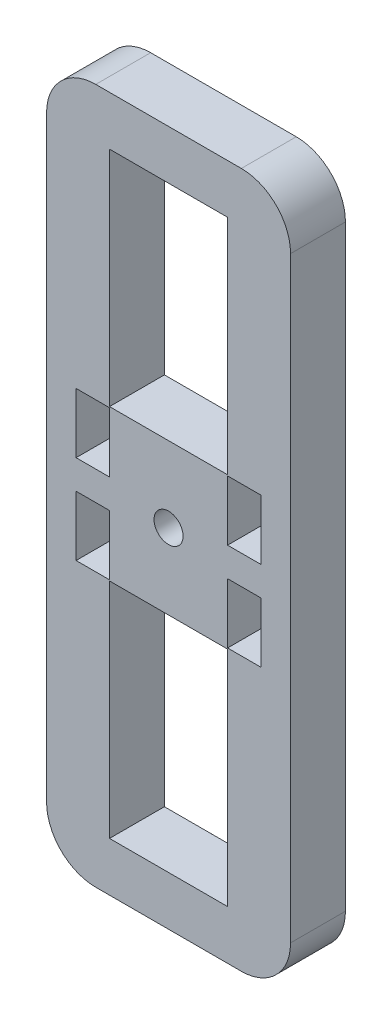
ISO-10303-21;
HEADER;
FILE_DESCRIPTION(('STEP AP214'),'2;1');
FILE_NAME('part.step','',(''),(''),'','','');
FILE_SCHEMA(('AUTOMOTIVE_DESIGN { 1 0 10303 214 1 1 1 1 }'));
ENDSEC;
DATA;
#1=APPLICATION_CONTEXT('core data for automotive mechanical design processes');
#2=APPLICATION_PROTOCOL_DEFINITION('international standard','automotive_design',2000,#1);
#3=PRODUCT_CONTEXT('',#1,'mechanical');
#4=PRODUCT('Part','Part','',(#3));
#5=PRODUCT_RELATED_PRODUCT_CATEGORY('part','',(#4));
#6=PRODUCT_DEFINITION_FORMATION('','',#4);
#7=PRODUCT_DEFINITION_CONTEXT('part definition',#1,'design');
#8=PRODUCT_DEFINITION('design','',#6,#7);
#9=PRODUCT_DEFINITION_SHAPE('','',#8);
#10=(LENGTH_UNIT() NAMED_UNIT(*) SI_UNIT(.MILLI.,.METRE.));
#11=(NAMED_UNIT(*) PLANE_ANGLE_UNIT() SI_UNIT($,.RADIAN.));
#12=(NAMED_UNIT(*) SI_UNIT($,.STERADIAN.) SOLID_ANGLE_UNIT());
#13=UNCERTAINTY_MEASURE_WITH_UNIT(LENGTH_MEASURE(1.E-05),#10,'distance_accuracy_value','');
#14=(GEOMETRIC_REPRESENTATION_CONTEXT(3) GLOBAL_UNCERTAINTY_ASSIGNED_CONTEXT((#13)) GLOBAL_UNIT_ASSIGNED_CONTEXT((#10,
#11,#12)) REPRESENTATION_CONTEXT('',''));
#15=CARTESIAN_POINT('',(0.,0.,0.));
#16=DIRECTION('',(0.,0.,1.));
#17=DIRECTION('',(1.,0.,0.));
#18=AXIS2_PLACEMENT_3D('',#15,#16,#17);
#19=CARTESIAN_POINT('',(0.,432.614671906504,5.58));
#20=DIRECTION('',(0.,1.,0.));
#21=DIRECTION('',(0.,0.,1.));
#22=AXIS2_PLACEMENT_3D('',#19,#20,#21);
#23=PLANE('',#22);
#24=DIRECTION('',(1.,0.,0.));
#25=VECTOR('',#24,1.);
#26=CARTESIAN_POINT('',(0.,432.614671906504,0.));
#27=LINE('',#26,#25);
#28=CARTESIAN_POINT('',(708.295729088938,432.614671906504,0.));
#29=VERTEX_POINT('',#28);
#30=CARTESIAN_POINT('',(723.095729088939,432.614671906504,0.));
#31=VERTEX_POINT('',#30);
#32=EDGE_CURVE('E349',#29,#31,#27,.T.);
#33=ORIENTED_EDGE('',*,*,#32,.T.);
#34=DIRECTION('',(0.,0.,-1.));
#35=VECTOR('',#34,1.);
#36=CARTESIAN_POINT('',(723.095729088939,432.614671906504,5.58));
#37=LINE('',#36,#35);
#38=CARTESIAN_POINT('',(723.095729088939,432.614671906504,5.58));
#39=VERTEX_POINT('',#38);
#40=EDGE_CURVE('E11',#39,#31,#37,.T.);
#41=ORIENTED_EDGE('',*,*,#40,.F.);
#42=DIRECTION('',(1.,0.,0.));
#43=VECTOR('',#42,1.);
#44=CARTESIAN_POINT('',(0.,432.614671906504,5.58));
#45=LINE('',#44,#43);
#46=CARTESIAN_POINT('',(708.295729088938,432.614671906504,5.58));
#47=VERTEX_POINT('',#46);
#48=EDGE_CURVE('E512',#47,#39,#45,.T.);
#49=ORIENTED_EDGE('',*,*,#48,.F.);
#50=DIRECTION('',(0.,0.,-1.));
#51=VECTOR('',#50,1.);
#52=CARTESIAN_POINT('',(708.295729088938,432.614671906504,5.58));
#53=LINE('',#52,#51);
#54=EDGE_CURVE('E53',#47,#29,#53,.T.);
#55=ORIENTED_EDGE('',*,*,#54,.T.);
#56=EDGE_LOOP('',(#33,#41,#49,#55));
#57=FACE_BOUND('',#56,.T.);
#58=ADVANCED_FACE('F34',(#57),#23,.F.);
#59=CARTESIAN_POINT('',(723.095729088939,437.614671906504,5.58));
#60=DIRECTION('',(0.,0.,-1.));
#61=DIRECTION('',(-1.,0.,0.));
#62=AXIS2_PLACEMENT_3D('',#59,#60,#61);
#63=CYLINDRICAL_SURFACE('',#62,5.);
#64=CARTESIAN_POINT('',(723.095729088939,437.614671906504,0.));
#65=DIRECTION('',(0.,0.,1.));
#66=DIRECTION('',(1.,0.,0.));
#67=AXIS2_PLACEMENT_3D('',#64,#65,#66);
#68=CIRCLE('',#67,5.);
#69=CARTESIAN_POINT('',(728.095729088939,437.614671906504,0.));
#70=VERTEX_POINT('',#69);
#71=EDGE_CURVE('E351',#31,#70,#68,.T.);
#72=ORIENTED_EDGE('',*,*,#71,.T.);
#73=DIRECTION('',(0.,0.,-1.));
#74=VECTOR('',#73,1.);
#75=CARTESIAN_POINT('',(728.095729088939,437.614671906504,5.58));
#76=LINE('',#75,#74);
#77=CARTESIAN_POINT('',(728.095729088939,437.614671906504,5.58));
#78=VERTEX_POINT('',#77);
#79=EDGE_CURVE('E44',#78,#70,#76,.T.);
#80=ORIENTED_EDGE('',*,*,#79,.F.);
#81=CARTESIAN_POINT('',(723.095729088939,437.614671906504,5.58));
#82=DIRECTION('',(0.,0.,1.));
#83=DIRECTION('',(1.,0.,0.));
#84=AXIS2_PLACEMENT_3D('',#81,#82,#83);
#85=CIRCLE('',#84,5.);
#86=EDGE_CURVE('E514',#39,#78,#85,.T.);
#87=ORIENTED_EDGE('',*,*,#86,.F.);
#88=ORIENTED_EDGE('',*,*,#40,.T.);
#89=EDGE_LOOP('',(#72,#80,#87,#88));
#90=FACE_BOUND('',#89,.T.);
#91=ADVANCED_FACE('F539',(#90),#63,.T.);
#92=CARTESIAN_POINT('',(728.095729088939,0.,5.58));
#93=DIRECTION('',(1.,0.,0.));
#94=DIRECTION('',(0.,0.,-1.));
#95=AXIS2_PLACEMENT_3D('',#92,#93,#94);
#96=PLANE('',#95);
#97=DIRECTION('',(0.,-1.,0.));
#98=VECTOR('',#97,1.);
#99=CARTESIAN_POINT('',(728.095729088939,0.,0.));
#100=LINE('',#99,#98);
#101=CARTESIAN_POINT('',(728.095729088939,498.294671906504,0.));
#102=VERTEX_POINT('',#101);
#103=EDGE_CURVE('E354',#102,#70,#100,.T.);
#104=ORIENTED_EDGE('',*,*,#103,.F.);
#105=DIRECTION('',(0.,0.,-1.));
#106=VECTOR('',#105,1.);
#107=CARTESIAN_POINT('',(728.095729088939,498.294671906504,5.58));
#108=LINE('',#107,#106);
#109=CARTESIAN_POINT('',(728.095729088939,498.294671906504,5.58));
#110=VERTEX_POINT('',#109);
#111=EDGE_CURVE('E376',#110,#102,#108,.T.);
#112=ORIENTED_EDGE('',*,*,#111,.F.);
#113=DIRECTION('',(0.,-1.,0.));
#114=VECTOR('',#113,1.);
#115=CARTESIAN_POINT('',(728.095729088939,0.,5.58));
#116=LINE('',#115,#114);
#117=EDGE_CURVE('E516',#110,#78,#116,.T.);
#118=ORIENTED_EDGE('',*,*,#117,.T.);
#119=ORIENTED_EDGE('',*,*,#79,.T.);
#120=EDGE_LOOP('',(#104,#112,#118,#119));
#121=FACE_BOUND('',#120,.T.);
#122=ADVANCED_FACE('F544',(#121),#96,.T.);
#123=CARTESIAN_POINT('',(723.095729088939,498.294671906504,5.58));
#124=DIRECTION('',(0.,0.,-1.));
#125=DIRECTION('',(-1.,0.,0.));
#126=AXIS2_PLACEMENT_3D('',#123,#124,#125);
#127=CYLINDRICAL_SURFACE('',#126,5.);
#128=CARTESIAN_POINT('',(723.095729088939,498.294671906504,0.));
#129=DIRECTION('',(0.,0.,1.));
#130=DIRECTION('',(1.,0.,0.));
#131=AXIS2_PLACEMENT_3D('',#128,#129,#130);
#132=CIRCLE('',#131,5.);
#133=CARTESIAN_POINT('',(723.095729088939,503.294671906504,0.));
#134=VERTEX_POINT('',#133);
#135=EDGE_CURVE('E357',#134,#102,#132,.F.);
#136=ORIENTED_EDGE('',*,*,#135,.F.);
#137=DIRECTION('',(0.,0.,-1.));
#138=VECTOR('',#137,1.);
#139=CARTESIAN_POINT('',(723.095729088939,503.294671906504,5.58));
#140=LINE('',#139,#138);
#141=CARTESIAN_POINT('',(723.095729088939,503.294671906504,5.58));
#142=VERTEX_POINT('',#141);
#143=EDGE_CURVE('E374',#142,#134,#140,.T.);
#144=ORIENTED_EDGE('',*,*,#143,.F.);
#145=CARTESIAN_POINT('',(723.095729088939,498.294671906504,5.58));
#146=DIRECTION('',(0.,0.,1.));
#147=DIRECTION('',(1.,0.,0.));
#148=AXIS2_PLACEMENT_3D('',#145,#146,#147);
#149=CIRCLE('',#148,5.);
#150=EDGE_CURVE('E519',#142,#110,#149,.F.);
#151=ORIENTED_EDGE('',*,*,#150,.T.);
#152=ORIENTED_EDGE('',*,*,#111,.T.);
#153=EDGE_LOOP('',(#136,#144,#151,#152));
#154=FACE_BOUND('',#153,.T.);
#155=ADVANCED_FACE('F716',(#154),#127,.T.);
#156=CARTESIAN_POINT('',(0.,503.294671906504,5.58));
#157=DIRECTION('',(0.,1.,0.));
#158=DIRECTION('',(0.,0.,1.));
#159=AXIS2_PLACEMENT_3D('',#156,#157,#158);
#160=PLANE('',#159);
#161=DIRECTION('',(1.,0.,0.));
#162=VECTOR('',#161,1.);
#163=CARTESIAN_POINT('',(0.,503.294671906504,0.));
#164=LINE('',#163,#162);
#165=CARTESIAN_POINT('',(708.295729088938,503.294671906504,0.));
#166=VERTEX_POINT('',#165);
#167=EDGE_CURVE('E360',#166,#134,#164,.T.);
#168=ORIENTED_EDGE('',*,*,#167,.F.);
#169=DIRECTION('',(0.,0.,-1.));
#170=VECTOR('',#169,1.);
#171=CARTESIAN_POINT('',(708.295729088938,503.294671906504,5.58));
#172=LINE('',#171,#170);
#173=CARTESIAN_POINT('',(708.295729088938,503.294671906504,5.58));
#174=VERTEX_POINT('',#173);
#175=EDGE_CURVE('E271',#174,#166,#172,.T.);
#176=ORIENTED_EDGE('',*,*,#175,.F.);
#177=DIRECTION('',(1.,0.,0.));
#178=VECTOR('',#177,1.);
#179=CARTESIAN_POINT('',(0.,503.294671906504,5.58));
#180=LINE('',#179,#178);
#181=EDGE_CURVE('E261',#174,#142,#180,.T.);
#182=ORIENTED_EDGE('',*,*,#181,.T.);
#183=ORIENTED_EDGE('',*,*,#143,.T.);
#184=EDGE_LOOP('',(#168,#176,#182,#183));
#185=FACE_BOUND('',#184,.T.);
#186=ADVANCED_FACE('F523',(#185),#160,.T.);
#187=CARTESIAN_POINT('',(708.295729088938,498.294671906504,5.58));
#188=DIRECTION('',(0.,0.,-1.));
#189=DIRECTION('',(-1.,0.,0.));
#190=AXIS2_PLACEMENT_3D('',#187,#188,#189);
#191=CYLINDRICAL_SURFACE('',#190,5.);
#192=CARTESIAN_POINT('',(708.295729088938,498.294671906504,0.));
#193=DIRECTION('',(0.,0.,1.));
#194=DIRECTION('',(1.,0.,0.));
#195=AXIS2_PLACEMENT_3D('',#192,#193,#194);
#196=CIRCLE('',#195,5.);
#197=CARTESIAN_POINT('',(703.295729088938,498.294671906504,0.));
#198=VERTEX_POINT('',#197);
#199=EDGE_CURVE('E268',#166,#198,#196,.T.);
#200=ORIENTED_EDGE('',*,*,#199,.T.);
#201=DIRECTION('',(0.,0.,-1.));
#202=VECTOR('',#201,1.);
#203=CARTESIAN_POINT('',(703.295729088938,498.294671906504,5.58));
#204=LINE('',#203,#202);
#205=CARTESIAN_POINT('',(703.295729088938,498.294671906504,5.58));
#206=VERTEX_POINT('',#205);
#207=EDGE_CURVE('E265',#206,#198,#204,.T.);
#208=ORIENTED_EDGE('',*,*,#207,.F.);
#209=CARTESIAN_POINT('',(708.295729088938,498.294671906504,5.58));
#210=DIRECTION('',(0.,0.,1.));
#211=DIRECTION('',(1.,0.,0.));
#212=AXIS2_PLACEMENT_3D('',#209,#210,#211);
#213=CIRCLE('',#212,5.);
#214=EDGE_CURVE('E252',#174,#206,#213,.T.);
#215=ORIENTED_EDGE('',*,*,#214,.F.);
#216=ORIENTED_EDGE('',*,*,#175,.T.);
#217=EDGE_LOOP('',(#200,#208,#215,#216));
#218=FACE_BOUND('',#217,.T.);
#219=ADVANCED_FACE('F266',(#218),#191,.T.);
#220=CARTESIAN_POINT('',(703.295729088938,0.,5.58));
#221=DIRECTION('',(1.,0.,0.));
#222=DIRECTION('',(0.,0.,-1.));
#223=AXIS2_PLACEMENT_3D('',#220,#221,#222);
#224=PLANE('',#223);
#225=DIRECTION('',(0.,-1.,0.));
#226=VECTOR('',#225,1.);
#227=CARTESIAN_POINT('',(703.295729088938,0.,0.));
#228=LINE('',#227,#226);
#229=CARTESIAN_POINT('',(703.295729088938,437.614671906504,0.));
#230=VERTEX_POINT('',#229);
#231=EDGE_CURVE('E364',#198,#230,#228,.T.);
#232=ORIENTED_EDGE('',*,*,#231,.T.);
#233=DIRECTION('',(0.,0.,-1.));
#234=VECTOR('',#233,1.);
#235=CARTESIAN_POINT('',(703.295729088938,437.614671906504,5.58));
#236=LINE('',#235,#234);
#237=CARTESIAN_POINT('',(703.295729088938,437.614671906504,5.58));
#238=VERTEX_POINT('',#237);
#239=EDGE_CURVE('E152',#238,#230,#236,.T.);
#240=ORIENTED_EDGE('',*,*,#239,.F.);
#241=DIRECTION('',(0.,-1.,0.));
#242=VECTOR('',#241,1.);
#243=CARTESIAN_POINT('',(703.295729088938,0.,5.58));
#244=LINE('',#243,#242);
#245=EDGE_CURVE('E258',#206,#238,#244,.T.);
#246=ORIENTED_EDGE('',*,*,#245,.F.);
#247=ORIENTED_EDGE('',*,*,#207,.T.);
#248=EDGE_LOOP('',(#232,#240,#246,#247));
#249=FACE_BOUND('',#248,.T.);
#250=ADVANCED_FACE('F273',(#249),#224,.F.);
#251=CARTESIAN_POINT('',(0.,437.614671906504,5.58));
#252=DIRECTION('',(0.,1.,0.));
#253=DIRECTION('',(0.,0.,1.));
#254=AXIS2_PLACEMENT_3D('',#251,#252,#253);
#255=PLANE('',#254);
#256=DIRECTION('',(1.,0.,0.));
#257=VECTOR('',#256,1.);
#258=CARTESIAN_POINT('',(0.,437.614671906504,0.));
#259=LINE('',#258,#257);
#260=CARTESIAN_POINT('',(709.695729088939,437.614671906504,0.));
#261=VERTEX_POINT('',#260);
#262=CARTESIAN_POINT('',(721.695729088938,437.614671906504,0.));
#263=VERTEX_POINT('',#262);
#264=EDGE_CURVE('E334',#261,#263,#259,.T.);
#265=ORIENTED_EDGE('',*,*,#264,.F.);
#266=DIRECTION('',(0.,0.,-1.));
#267=VECTOR('',#266,1.);
#268=CARTESIAN_POINT('',(709.695729088939,437.614671906504,5.58));
#269=LINE('',#268,#267);
#270=CARTESIAN_POINT('',(709.695729088939,437.614671906504,5.58));
#271=VERTEX_POINT('',#270);
#272=EDGE_CURVE('E371',#271,#261,#269,.T.);
#273=ORIENTED_EDGE('',*,*,#272,.F.);
#274=DIRECTION('',(1.,0.,0.));
#275=VECTOR('',#274,1.);
#276=CARTESIAN_POINT('',(0.,437.614671906504,5.58));
#277=LINE('',#276,#275);
#278=CARTESIAN_POINT('',(721.695729088938,437.614671906504,5.58));
#279=VERTEX_POINT('',#278);
#280=EDGE_CURVE('E497',#271,#279,#277,.T.);
#281=ORIENTED_EDGE('',*,*,#280,.T.);
#282=DIRECTION('',(0.,0.,-1.));
#283=VECTOR('',#282,1.);
#284=CARTESIAN_POINT('',(721.695729088938,437.614671906504,5.58));
#285=LINE('',#284,#283);
#286=EDGE_CURVE('E379',#279,#263,#285,.T.);
#287=ORIENTED_EDGE('',*,*,#286,.T.);
#288=EDGE_LOOP('',(#265,#273,#281,#287));
#289=FACE_BOUND('',#288,.T.);
#290=ADVANCED_FACE('F566',(#289),#255,.T.);
#291=CARTESIAN_POINT('',(709.695729088941,3.47637564047069E-12,5.58));
#292=DIRECTION('',(1.,0.,0.));
#293=DIRECTION('',(0.,1.,0.));
#294=AXIS2_PLACEMENT_3D('',#291,#292,#293);
#295=PLANE('',#294);
#296=DIRECTION('',(0.,-1.,0.));
#297=VECTOR('',#296,1.);
#298=CARTESIAN_POINT('',(709.695729088941,3.47637564047069E-12,0.));
#299=LINE('',#298,#297);
#300=CARTESIAN_POINT('',(709.695729088938,460.279671906504,0.));
#301=VERTEX_POINT('',#300);
#302=EDGE_CURVE('E337',#301,#261,#299,.T.);
#303=ORIENTED_EDGE('',*,*,#302,.F.);
#304=DIRECTION('',(0.,0.,-1.));
#305=VECTOR('',#304,1.);
#306=CARTESIAN_POINT('',(709.695729088938,460.279671906504,5.58));
#307=LINE('',#306,#305);
#308=CARTESIAN_POINT('',(709.695729088938,460.279671906504,5.58));
#309=VERTEX_POINT('',#308);
#310=EDGE_CURVE('E384',#309,#301,#307,.T.);
#311=ORIENTED_EDGE('',*,*,#310,.F.);
#312=DIRECTION('',(0.,-1.,0.));
#313=VECTOR('',#312,1.);
#314=CARTESIAN_POINT('',(709.695729088941,3.47637564047069E-12,5.58));
#315=LINE('',#314,#313);
#316=EDGE_CURVE('E500',#309,#271,#315,.T.);
#317=ORIENTED_EDGE('',*,*,#316,.T.);
#318=ORIENTED_EDGE('',*,*,#272,.T.);
#319=EDGE_LOOP('',(#303,#311,#317,#318));
#320=FACE_BOUND('',#319,.T.);
#321=ADVANCED_FACE('F562',(#320),#295,.T.);
#322=CARTESIAN_POINT('',(0.,460.279671906504,5.58));
#323=DIRECTION('',(0.,-1.,0.));
#324=DIRECTION('',(0.,0.,-1.));
#325=AXIS2_PLACEMENT_3D('',#322,#323,#324);
#326=PLANE('',#325);
#327=DIRECTION('',(-1.,0.,0.));
#328=VECTOR('',#327,1.);
#329=CARTESIAN_POINT('',(0.,460.279671906504,0.));
#330=LINE('',#329,#328);
#331=CARTESIAN_POINT('',(721.695729088938,460.279671906504,0.));
#332=VERTEX_POINT('',#331);
#333=EDGE_CURVE('E340',#332,#301,#330,.T.);
#334=ORIENTED_EDGE('',*,*,#333,.F.);
#335=DIRECTION('',(0.,0.,-1.));
#336=VECTOR('',#335,1.);
#337=CARTESIAN_POINT('',(721.695729088938,460.279671906504,5.58));
#338=LINE('',#337,#336);
#339=CARTESIAN_POINT('',(721.695729088938,460.279671906504,5.58));
#340=VERTEX_POINT('',#339);
#341=EDGE_CURVE('E381',#340,#332,#338,.T.);
#342=ORIENTED_EDGE('',*,*,#341,.F.);
#343=DIRECTION('',(-1.,0.,0.));
#344=VECTOR('',#343,1.);
#345=CARTESIAN_POINT('',(0.,460.279671906504,5.58));
#346=LINE('',#345,#344);
#347=EDGE_CURVE('E503',#340,#309,#346,.T.);
#348=ORIENTED_EDGE('',*,*,#347,.T.);
#349=ORIENTED_EDGE('',*,*,#310,.T.);
#350=EDGE_LOOP('',(#334,#342,#348,#349));
#351=FACE_BOUND('',#350,.T.);
#352=ADVANCED_FACE('F558',(#351),#326,.T.);
#353=CARTESIAN_POINT('',(709.695729088938,0.,5.58));
#354=DIRECTION('',(-1.,0.,0.));
#355=DIRECTION('',(0.,0.,1.));
#356=AXIS2_PLACEMENT_3D('',#353,#354,#355);
#357=PLANE('',#356);
#358=DIRECTION('',(0.,1.,0.));
#359=VECTOR('',#358,1.);
#360=CARTESIAN_POINT('',(709.695729088938,0.,0.));
#361=LINE('',#360,#359);
#362=CARTESIAN_POINT('',(709.695729088938,460.379671906504,0.));
#363=VERTEX_POINT('',#362);
#364=CARTESIAN_POINT('',(709.695729088938,466.479671906504,0.));
#365=VERTEX_POINT('',#364);
#366=EDGE_CURVE('E322',#363,#365,#361,.T.);
#367=ORIENTED_EDGE('',*,*,#366,.F.);
#368=DIRECTION('',(0.,0.,-1.));
#369=VECTOR('',#368,1.);
#370=CARTESIAN_POINT('',(709.695729088938,460.379671906504,5.58));
#371=LINE('',#370,#369);
#372=CARTESIAN_POINT('',(709.695729088938,460.379671906504,5.58));
#373=VERTEX_POINT('',#372);
#374=EDGE_CURVE('E382',#373,#363,#371,.T.);
#375=ORIENTED_EDGE('',*,*,#374,.F.);
#376=DIRECTION('',(0.,1.,0.));
#377=VECTOR('',#376,1.);
#378=CARTESIAN_POINT('',(709.695729088938,0.,5.58));
#379=LINE('',#378,#377);
#380=CARTESIAN_POINT('',(709.695729088938,466.479671906504,5.58));
#381=VERTEX_POINT('',#380);
#382=EDGE_CURVE('E486',#373,#381,#379,.T.);
#383=ORIENTED_EDGE('',*,*,#382,.T.);
#384=DIRECTION('',(0.,0.,-1.));
#385=VECTOR('',#384,1.);
#386=CARTESIAN_POINT('',(709.695729088938,466.479671906504,5.58));
#387=LINE('',#386,#385);
#388=EDGE_CURVE('E387',#381,#365,#387,.T.);
#389=ORIENTED_EDGE('',*,*,#388,.T.);
#390=EDGE_LOOP('',(#367,#375,#383,#389));
#391=FACE_BOUND('',#390,.T.);
#392=ADVANCED_FACE('F561',(#391),#357,.T.);
#393=CARTESIAN_POINT('',(0.,460.379671906504,5.58));
#394=DIRECTION('',(0.,-1.,0.));
#395=DIRECTION('',(0.,0.,-1.));
#396=AXIS2_PLACEMENT_3D('',#393,#394,#395);
#397=PLANE('',#396);
#398=DIRECTION('',(-1.,0.,0.));
#399=VECTOR('',#398,1.);
#400=CARTESIAN_POINT('',(0.,460.379671906504,0.));
#401=LINE('',#400,#399);
#402=CARTESIAN_POINT('',(706.295729088939,460.379671906504,0.));
#403=VERTEX_POINT('',#402);
#404=EDGE_CURVE('E325',#363,#403,#401,.T.);
#405=ORIENTED_EDGE('',*,*,#404,.T.);
#406=DIRECTION('',(0.,0.,-1.));
#407=VECTOR('',#406,1.);
#408=CARTESIAN_POINT('',(706.295729088939,460.379671906504,5.58));
#409=LINE('',#408,#407);
#410=CARTESIAN_POINT('',(706.295729088939,460.379671906504,5.58));
#411=VERTEX_POINT('',#410);
#412=EDGE_CURVE('E392',#411,#403,#409,.T.);
#413=ORIENTED_EDGE('',*,*,#412,.F.);
#414=DIRECTION('',(-1.,0.,0.));
#415=VECTOR('',#414,1.);
#416=CARTESIAN_POINT('',(0.,460.379671906504,5.58));
#417=LINE('',#416,#415);
#418=EDGE_CURVE('E489',#373,#411,#417,.T.);
#419=ORIENTED_EDGE('',*,*,#418,.F.);
#420=ORIENTED_EDGE('',*,*,#374,.T.);
#421=EDGE_LOOP('',(#405,#413,#419,#420));
#422=FACE_BOUND('',#421,.T.);
#423=ADVANCED_FACE('F579',(#422),#397,.F.);
#424=CARTESIAN_POINT('',(706.295729088939,0.,5.58));
#425=DIRECTION('',(1.,0.,0.));
#426=DIRECTION('',(0.,0.,-1.));
#427=AXIS2_PLACEMENT_3D('',#424,#425,#426);
#428=PLANE('',#427);
#429=DIRECTION('',(0.,-1.,0.));
#430=VECTOR('',#429,1.);
#431=CARTESIAN_POINT('',(706.295729088939,0.,0.));
#432=LINE('',#431,#430);
#433=CARTESIAN_POINT('',(706.295729088939,466.479671906504,0.));
#434=VERTEX_POINT('',#433);
#435=EDGE_CURVE('E328',#434,#403,#432,.T.);
#436=ORIENTED_EDGE('',*,*,#435,.F.);
#437=DIRECTION('',(0.,0.,-1.));
#438=VECTOR('',#437,1.);
#439=CARTESIAN_POINT('',(706.295729088939,466.479671906504,5.58));
#440=LINE('',#439,#438);
#441=CARTESIAN_POINT('',(706.295729088939,466.479671906504,5.58));
#442=VERTEX_POINT('',#441);
#443=EDGE_CURVE('E389',#442,#434,#440,.T.);
#444=ORIENTED_EDGE('',*,*,#443,.F.);
#445=DIRECTION('',(0.,-1.,0.));
#446=VECTOR('',#445,1.);
#447=CARTESIAN_POINT('',(706.295729088939,0.,5.58));
#448=LINE('',#447,#446);
#449=EDGE_CURVE('E491',#442,#411,#448,.T.);
#450=ORIENTED_EDGE('',*,*,#449,.T.);
#451=ORIENTED_EDGE('',*,*,#412,.T.);
#452=EDGE_LOOP('',(#436,#444,#450,#451));
#453=FACE_BOUND('',#452,.T.);
#454=ADVANCED_FACE('F575',(#453),#428,.T.);
#455=CARTESIAN_POINT('',(0.,469.429671906504,5.58));
#456=DIRECTION('',(0.,-1.,0.));
#457=DIRECTION('',(0.,0.,-1.));
#458=AXIS2_PLACEMENT_3D('',#455,#456,#457);
#459=PLANE('',#458);
#460=DIRECTION('',(-1.,0.,0.));
#461=VECTOR('',#460,1.);
#462=CARTESIAN_POINT('',(0.,469.429671906504,0.));
#463=LINE('',#462,#461);
#464=CARTESIAN_POINT('',(709.695729088938,469.429671906504,0.));
#465=VERTEX_POINT('',#464);
#466=CARTESIAN_POINT('',(706.295729088939,469.429671906504,0.));
#467=VERTEX_POINT('',#466);
#468=EDGE_CURVE('E311',#465,#467,#463,.T.);
#469=ORIENTED_EDGE('',*,*,#468,.T.);
#470=DIRECTION('',(0.,0.,-1.));
#471=VECTOR('',#470,1.);
#472=CARTESIAN_POINT('',(706.295729088939,469.429671906504,5.58));
#473=LINE('',#472,#471);
#474=CARTESIAN_POINT('',(706.295729088939,469.429671906504,5.58));
#475=VERTEX_POINT('',#474);
#476=EDGE_CURVE('E390',#475,#467,#473,.T.);
#477=ORIENTED_EDGE('',*,*,#476,.F.);
#478=DIRECTION('',(-1.,0.,0.));
#479=VECTOR('',#478,1.);
#480=CARTESIAN_POINT('',(0.,469.429671906504,5.58));
#481=LINE('',#480,#479);
#482=CARTESIAN_POINT('',(709.695729088938,469.429671906504,5.58));
#483=VERTEX_POINT('',#482);
#484=EDGE_CURVE('E476',#483,#475,#481,.T.);
#485=ORIENTED_EDGE('',*,*,#484,.F.);
#486=DIRECTION('',(0.,0.,-1.));
#487=VECTOR('',#486,1.);
#488=CARTESIAN_POINT('',(709.695729088938,469.429671906504,5.58));
#489=LINE('',#488,#487);
#490=EDGE_CURVE('E395',#483,#465,#489,.T.);
#491=ORIENTED_EDGE('',*,*,#490,.T.);
#492=EDGE_LOOP('',(#469,#477,#485,#491));
#493=FACE_BOUND('',#492,.T.);
#494=ADVANCED_FACE('F578',(#493),#459,.F.);
#495=CARTESIAN_POINT('',(706.295729088939,0.,5.58));
#496=DIRECTION('',(-1.,0.,0.));
#497=DIRECTION('',(0.,0.,1.));
#498=AXIS2_PLACEMENT_3D('',#495,#496,#497);
#499=PLANE('',#498);
#500=DIRECTION('',(0.,1.,0.));
#501=VECTOR('',#500,1.);
#502=CARTESIAN_POINT('',(706.295729088939,0.,0.));
#503=LINE('',#502,#501);
#504=CARTESIAN_POINT('',(706.295729088939,475.529671906504,0.));
#505=VERTEX_POINT('',#504);
#506=EDGE_CURVE('E314',#467,#505,#503,.T.);
#507=ORIENTED_EDGE('',*,*,#506,.T.);
#508=DIRECTION('',(0.,0.,-1.));
#509=VECTOR('',#508,1.);
#510=CARTESIAN_POINT('',(706.295729088939,475.529671906504,5.58));
#511=LINE('',#510,#509);
#512=CARTESIAN_POINT('',(706.295729088939,475.529671906504,5.58));
#513=VERTEX_POINT('',#512);
#514=EDGE_CURVE('E401',#513,#505,#511,.T.);
#515=ORIENTED_EDGE('',*,*,#514,.F.);
#516=DIRECTION('',(0.,1.,0.));
#517=VECTOR('',#516,1.);
#518=CARTESIAN_POINT('',(706.295729088939,0.,5.58));
#519=LINE('',#518,#517);
#520=EDGE_CURVE('E479',#475,#513,#519,.T.);
#521=ORIENTED_EDGE('',*,*,#520,.F.);
#522=ORIENTED_EDGE('',*,*,#476,.T.);
#523=EDGE_LOOP('',(#507,#515,#521,#522));
#524=FACE_BOUND('',#523,.T.);
#525=ADVANCED_FACE('F595',(#524),#499,.F.);
#526=CARTESIAN_POINT('',(0.,475.529671906504,5.58));
#527=DIRECTION('',(0.,-1.,0.));
#528=DIRECTION('',(0.,0.,-1.));
#529=AXIS2_PLACEMENT_3D('',#526,#527,#528);
#530=PLANE('',#529);
#531=DIRECTION('',(-1.,0.,0.));
#532=VECTOR('',#531,1.);
#533=CARTESIAN_POINT('',(0.,475.529671906504,0.));
#534=LINE('',#533,#532);
#535=CARTESIAN_POINT('',(709.695729088938,475.529671906504,0.));
#536=VERTEX_POINT('',#535);
#537=EDGE_CURVE('E317',#536,#505,#534,.T.);
#538=ORIENTED_EDGE('',*,*,#537,.F.);
#539=DIRECTION('',(0.,0.,-1.));
#540=VECTOR('',#539,1.);
#541=CARTESIAN_POINT('',(709.695729088938,475.529671906504,5.58));
#542=LINE('',#541,#540);
#543=CARTESIAN_POINT('',(709.695729088938,475.529671906504,5.58));
#544=VERTEX_POINT('',#543);
#545=EDGE_CURVE('E398',#544,#536,#542,.T.);
#546=ORIENTED_EDGE('',*,*,#545,.F.);
#547=DIRECTION('',(-1.,0.,0.));
#548=VECTOR('',#547,1.);
#549=CARTESIAN_POINT('',(0.,475.529671906504,5.58));
#550=LINE('',#549,#548);
#551=EDGE_CURVE('E481',#544,#513,#550,.T.);
#552=ORIENTED_EDGE('',*,*,#551,.T.);
#553=ORIENTED_EDGE('',*,*,#514,.T.);
#554=EDGE_LOOP('',(#538,#546,#552,#553));
#555=FACE_BOUND('',#554,.T.);
#556=ADVANCED_FACE('F591',(#555),#530,.T.);
#557=CARTESIAN_POINT('',(0.,475.629671906504,5.58));
#558=DIRECTION('',(0.,-1.,0.));
#559=DIRECTION('',(0.,0.,-1.));
#560=AXIS2_PLACEMENT_3D('',#557,#558,#559);
#561=PLANE('',#560);
#562=DIRECTION('',(-1.,0.,0.));
#563=VECTOR('',#562,1.);
#564=CARTESIAN_POINT('',(0.,475.629671906504,0.));
#565=LINE('',#564,#563);
#566=CARTESIAN_POINT('',(721.695729088938,475.629671906504,0.));
#567=VERTEX_POINT('',#566);
#568=CARTESIAN_POINT('',(709.695729088938,475.629671906504,0.));
#569=VERTEX_POINT('',#568);
#570=EDGE_CURVE('E302',#567,#569,#565,.T.);
#571=ORIENTED_EDGE('',*,*,#570,.T.);
#572=DIRECTION('',(0.,0.,-1.));
#573=VECTOR('',#572,1.);
#574=CARTESIAN_POINT('',(709.695729088938,475.629671906504,5.58));
#575=LINE('',#574,#573);
#576=CARTESIAN_POINT('',(709.695729088938,475.629671906504,5.58));
#577=VERTEX_POINT('',#576);
#578=EDGE_CURVE('E399',#577,#569,#575,.T.);
#579=ORIENTED_EDGE('',*,*,#578,.F.);
#580=DIRECTION('',(-1.,0.,0.));
#581=VECTOR('',#580,1.);
#582=CARTESIAN_POINT('',(0.,475.629671906504,5.58));
#583=LINE('',#582,#581);
#584=CARTESIAN_POINT('',(721.695729088938,475.629671906504,5.58));
#585=VERTEX_POINT('',#584);
#586=EDGE_CURVE('E467',#585,#577,#583,.T.);
#587=ORIENTED_EDGE('',*,*,#586,.F.);
#588=DIRECTION('',(0.,0.,-1.));
#589=VECTOR('',#588,1.);
#590=CARTESIAN_POINT('',(721.695729088938,475.629671906504,5.58));
#591=LINE('',#590,#589);
#592=EDGE_CURVE('E405',#585,#567,#591,.T.);
#593=ORIENTED_EDGE('',*,*,#592,.T.);
#594=EDGE_LOOP('',(#571,#579,#587,#593));
#595=FACE_BOUND('',#594,.T.);
#596=ADVANCED_FACE('F594',(#595),#561,.F.);
#597=CARTESIAN_POINT('',(709.695729088936,-3.47637564047067E-12,5.58));
#598=DIRECTION('',(-1.,0.,0.));
#599=DIRECTION('',(0.,-1.,0.));
#600=AXIS2_PLACEMENT_3D('',#597,#598,#599);
#601=PLANE('',#600);
#602=DIRECTION('',(0.,1.,0.));
#603=VECTOR('',#602,1.);
#604=CARTESIAN_POINT('',(709.695729088936,-3.47637564047067E-12,0.));
#605=LINE('',#604,#603);
#606=CARTESIAN_POINT('',(709.695729088939,498.294671906504,0.));
#607=VERTEX_POINT('',#606);
#608=EDGE_CURVE('E305',#569,#607,#605,.T.);
#609=ORIENTED_EDGE('',*,*,#608,.T.);
#610=DIRECTION('',(0.,0.,-1.));
#611=VECTOR('',#610,1.);
#612=CARTESIAN_POINT('',(709.695729088939,498.294671906504,5.58));
#613=LINE('',#612,#611);
#614=CARTESIAN_POINT('',(709.695729088939,498.294671906504,5.58));
#615=VERTEX_POINT('',#614);
#616=EDGE_CURVE('E412',#615,#607,#613,.T.);
#617=ORIENTED_EDGE('',*,*,#616,.F.);
#618=DIRECTION('',(0.,1.,0.));
#619=VECTOR('',#618,1.);
#620=CARTESIAN_POINT('',(709.695729088936,-3.47637564047067E-12,5.58));
#621=LINE('',#620,#619);
#622=EDGE_CURVE('E470',#577,#615,#621,.T.);
#623=ORIENTED_EDGE('',*,*,#622,.F.);
#624=ORIENTED_EDGE('',*,*,#578,.T.);
#625=EDGE_LOOP('',(#609,#617,#623,#624));
#626=FACE_BOUND('',#625,.T.);
#627=ADVANCED_FACE('F610',(#626),#601,.F.);
#628=CARTESIAN_POINT('',(0.,498.294671906504,5.58));
#629=DIRECTION('',(0.,1.,0.));
#630=DIRECTION('',(0.,0.,1.));
#631=AXIS2_PLACEMENT_3D('',#628,#629,#630);
#632=PLANE('',#631);
#633=DIRECTION('',(1.,0.,0.));
#634=VECTOR('',#633,1.);
#635=CARTESIAN_POINT('',(0.,498.294671906504,0.));
#636=LINE('',#635,#634);
#637=CARTESIAN_POINT('',(721.695729088938,498.294671906504,0.));
#638=VERTEX_POINT('',#637);
#639=EDGE_CURVE('E307',#607,#638,#636,.T.);
#640=ORIENTED_EDGE('',*,*,#639,.T.);
#641=DIRECTION('',(0.,0.,-1.));
#642=VECTOR('',#641,1.);
#643=CARTESIAN_POINT('',(721.695729088938,498.294671906504,5.58));
#644=LINE('',#643,#642);
#645=CARTESIAN_POINT('',(721.695729088938,498.294671906504,5.58));
#646=VERTEX_POINT('',#645);
#647=EDGE_CURVE('E408',#646,#638,#644,.T.);
#648=ORIENTED_EDGE('',*,*,#647,.F.);
#649=DIRECTION('',(1.,0.,0.));
#650=VECTOR('',#649,1.);
#651=CARTESIAN_POINT('',(0.,498.294671906504,5.58));
#652=LINE('',#651,#650);
#653=EDGE_CURVE('E472',#615,#646,#652,.T.);
#654=ORIENTED_EDGE('',*,*,#653,.F.);
#655=ORIENTED_EDGE('',*,*,#616,.T.);
#656=EDGE_LOOP('',(#640,#648,#654,#655));
#657=FACE_BOUND('',#656,.T.);
#658=ADVANCED_FACE('F606',(#657),#632,.F.);
#659=CARTESIAN_POINT('',(721.695729088938,0.,5.58));
#660=DIRECTION('',(1.,0.,0.));
#661=DIRECTION('',(0.,0.,-1.));
#662=AXIS2_PLACEMENT_3D('',#659,#660,#661);
#663=PLANE('',#662);
#664=DIRECTION('',(0.,-1.,0.));
#665=VECTOR('',#664,1.);
#666=CARTESIAN_POINT('',(721.695729088938,0.,0.));
#667=LINE('',#666,#665);
#668=CARTESIAN_POINT('',(721.695729088938,475.529671906504,0.));
#669=VERTEX_POINT('',#668);
#670=CARTESIAN_POINT('',(721.695729088938,469.429671906504,0.));
#671=VERTEX_POINT('',#670);
#672=EDGE_CURVE('E290',#669,#671,#667,.T.);
#673=ORIENTED_EDGE('',*,*,#672,.F.);
#674=DIRECTION('',(0.,0.,-1.));
#675=VECTOR('',#674,1.);
#676=CARTESIAN_POINT('',(721.695729088938,475.529671906504,5.58));
#677=LINE('',#676,#675);
#678=CARTESIAN_POINT('',(721.695729088938,475.529671906504,5.58));
#679=VERTEX_POINT('',#678);
#680=EDGE_CURVE('E409',#679,#669,#677,.T.);
#681=ORIENTED_EDGE('',*,*,#680,.F.);
#682=DIRECTION('',(0.,-1.,0.));
#683=VECTOR('',#682,1.);
#684=CARTESIAN_POINT('',(721.695729088938,0.,5.58));
#685=LINE('',#684,#683);
#686=CARTESIAN_POINT('',(721.695729088938,469.429671906504,5.58));
#687=VERTEX_POINT('',#686);
#688=EDGE_CURVE('E452',#679,#687,#685,.T.);
#689=ORIENTED_EDGE('',*,*,#688,.T.);
#690=DIRECTION('',(0.,0.,-1.));
#691=VECTOR('',#690,1.);
#692=CARTESIAN_POINT('',(721.695729088938,469.429671906504,5.58));
#693=LINE('',#692,#691);
#694=EDGE_CURVE('E417',#687,#671,#693,.T.);
#695=ORIENTED_EDGE('',*,*,#694,.T.);
#696=EDGE_LOOP('',(#673,#681,#689,#695));
#697=FACE_BOUND('',#696,.T.);
#698=ADVANCED_FACE('F609',(#697),#663,.T.);
#699=CARTESIAN_POINT('',(0.,475.529671906504,5.58));
#700=DIRECTION('',(0.,1.,0.));
#701=DIRECTION('',(0.,0.,1.));
#702=AXIS2_PLACEMENT_3D('',#699,#700,#701);
#703=PLANE('',#702);
#704=DIRECTION('',(1.,0.,0.));
#705=VECTOR('',#704,1.);
#706=CARTESIAN_POINT('',(0.,475.529671906504,0.));
#707=LINE('',#706,#705);
#708=CARTESIAN_POINT('',(725.095729088938,475.529671906504,0.));
#709=VERTEX_POINT('',#708);
#710=EDGE_CURVE('E293',#669,#709,#707,.T.);
#711=ORIENTED_EDGE('',*,*,#710,.T.);
#712=DIRECTION('',(0.,0.,-1.));
#713=VECTOR('',#712,1.);
#714=CARTESIAN_POINT('',(725.095729088938,475.529671906504,5.58));
#715=LINE('',#714,#713);
#716=CARTESIAN_POINT('',(725.095729088938,475.529671906504,5.58));
#717=VERTEX_POINT('',#716);
#718=EDGE_CURVE('E421',#717,#709,#715,.T.);
#719=ORIENTED_EDGE('',*,*,#718,.F.);
#720=DIRECTION('',(1.,0.,0.));
#721=VECTOR('',#720,1.);
#722=CARTESIAN_POINT('',(0.,475.529671906504,5.58));
#723=LINE('',#722,#721);
#724=EDGE_CURVE('E459',#679,#717,#723,.T.);
#725=ORIENTED_EDGE('',*,*,#724,.F.);
#726=ORIENTED_EDGE('',*,*,#680,.T.);
#727=EDGE_LOOP('',(#711,#719,#725,#726));
#728=FACE_BOUND('',#727,.T.);
#729=ADVANCED_FACE('F624',(#728),#703,.F.);
#730=CARTESIAN_POINT('',(725.095729088938,0.,5.58));
#731=DIRECTION('',(-1.,0.,0.));
#732=DIRECTION('',(0.,0.,1.));
#733=AXIS2_PLACEMENT_3D('',#730,#731,#732);
#734=PLANE('',#733);
#735=DIRECTION('',(0.,1.,0.));
#736=VECTOR('',#735,1.);
#737=CARTESIAN_POINT('',(725.095729088938,0.,0.));
#738=LINE('',#737,#736);
#739=CARTESIAN_POINT('',(725.095729088938,469.429671906504,0.));
#740=VERTEX_POINT('',#739);
#741=EDGE_CURVE('E296',#740,#709,#738,.T.);
#742=ORIENTED_EDGE('',*,*,#741,.F.);
#743=DIRECTION('',(0.,0.,-1.));
#744=VECTOR('',#743,1.);
#745=CARTESIAN_POINT('',(725.095729088938,469.429671906504,5.58));
#746=LINE('',#745,#744);
#747=CARTESIAN_POINT('',(725.095729088938,469.429671906504,5.58));
#748=VERTEX_POINT('',#747);
#749=EDGE_CURVE('E419',#748,#740,#746,.T.);
#750=ORIENTED_EDGE('',*,*,#749,.F.);
#751=DIRECTION('',(0.,1.,0.));
#752=VECTOR('',#751,1.);
#753=CARTESIAN_POINT('',(725.095729088938,0.,5.58));
#754=LINE('',#753,#752);
#755=EDGE_CURVE('E461',#748,#717,#754,.T.);
#756=ORIENTED_EDGE('',*,*,#755,.T.);
#757=ORIENTED_EDGE('',*,*,#718,.T.);
#758=EDGE_LOOP('',(#742,#750,#756,#757));
#759=FACE_BOUND('',#758,.T.);
#760=ADVANCED_FACE('F621',(#759),#734,.T.);
#761=CARTESIAN_POINT('',(0.,460.379671906504,5.58));
#762=DIRECTION('',(0.,1.,0.));
#763=DIRECTION('',(0.,0.,1.));
#764=AXIS2_PLACEMENT_3D('',#761,#762,#763);
#765=PLANE('',#764);
#766=DIRECTION('',(1.,0.,0.));
#767=VECTOR('',#766,1.);
#768=CARTESIAN_POINT('',(0.,460.379671906504,0.));
#769=LINE('',#768,#767);
#770=CARTESIAN_POINT('',(721.695729088938,460.379671906504,0.));
#771=VERTEX_POINT('',#770);
#772=CARTESIAN_POINT('',(725.095729088938,460.379671906504,0.));
#773=VERTEX_POINT('',#772);
#774=EDGE_CURVE('E280',#771,#773,#769,.T.);
#775=ORIENTED_EDGE('',*,*,#774,.F.);
#776=DIRECTION('',(0.,0.,-1.));
#777=VECTOR('',#776,1.);
#778=CARTESIAN_POINT('',(721.695729088938,460.379671906504,5.58));
#779=LINE('',#778,#777);
#780=CARTESIAN_POINT('',(721.695729088938,460.379671906504,5.58));
#781=VERTEX_POINT('',#780);
#782=EDGE_CURVE('E38',#781,#771,#779,.T.);
#783=ORIENTED_EDGE('',*,*,#782,.F.);
#784=DIRECTION('',(1.,0.,0.));
#785=VECTOR('',#784,1.);
#786=CARTESIAN_POINT('',(0.,460.379671906504,5.58));
#787=LINE('',#786,#785);
#788=CARTESIAN_POINT('',(725.095729088938,460.379671906504,5.58));
#789=VERTEX_POINT('',#788);
#790=EDGE_CURVE('E369',#781,#789,#787,.T.);
#791=ORIENTED_EDGE('',*,*,#790,.T.);
#792=DIRECTION('',(0.,0.,-1.));
#793=VECTOR('',#792,1.);
#794=CARTESIAN_POINT('',(725.095729088938,460.379671906504,5.58));
#795=LINE('',#794,#793);
#796=EDGE_CURVE('E276',#789,#773,#795,.T.);
#797=ORIENTED_EDGE('',*,*,#796,.T.);
#798=EDGE_LOOP('',(#775,#783,#791,#797));
#799=FACE_BOUND('',#798,.T.);
#800=ADVANCED_FACE('F36',(#799),#765,.T.);
#801=CARTESIAN_POINT('',(721.695729088938,0.,5.58));
#802=DIRECTION('',(-1.,0.,0.));
#803=DIRECTION('',(0.,0.,1.));
#804=AXIS2_PLACEMENT_3D('',#801,#802,#803);
#805=PLANE('',#804);
#806=DIRECTION('',(0.,1.,0.));
#807=VECTOR('',#806,1.);
#808=CARTESIAN_POINT('',(721.695729088938,0.,0.));
#809=LINE('',#808,#807);
#810=CARTESIAN_POINT('',(721.695729088938,466.479671906504,0.));
#811=VERTEX_POINT('',#810);
#812=EDGE_CURVE('E283',#771,#811,#809,.T.);
#813=ORIENTED_EDGE('',*,*,#812,.T.);
#814=DIRECTION('',(0.,0.,-1.));
#815=VECTOR('',#814,1.);
#816=CARTESIAN_POINT('',(721.695729088938,466.479671906504,5.58));
#817=LINE('',#816,#815);
#818=CARTESIAN_POINT('',(721.695729088938,466.479671906504,5.58));
#819=VERTEX_POINT('',#818);
#820=EDGE_CURVE('E427',#819,#811,#817,.T.);
#821=ORIENTED_EDGE('',*,*,#820,.F.);
#822=DIRECTION('',(0.,1.,0.));
#823=VECTOR('',#822,1.);
#824=CARTESIAN_POINT('',(721.695729088938,0.,5.58));
#825=LINE('',#824,#823);
#826=EDGE_CURVE('E436',#781,#819,#825,.T.);
#827=ORIENTED_EDGE('',*,*,#826,.F.);
#828=ORIENTED_EDGE('',*,*,#782,.T.);
#829=EDGE_LOOP('',(#813,#821,#827,#828));
#830=FACE_BOUND('',#829,.T.);
#831=ADVANCED_FACE('F435',(#830),#805,.F.);
#832=CARTESIAN_POINT('',(0.,466.479671906504,5.58));
#833=DIRECTION('',(0.,1.,0.));
#834=DIRECTION('',(0.,0.,1.));
#835=AXIS2_PLACEMENT_3D('',#832,#833,#834);
#836=PLANE('',#835);
#837=DIRECTION('',(1.,0.,0.));
#838=VECTOR('',#837,1.);
#839=CARTESIAN_POINT('',(0.,466.479671906504,0.));
#840=LINE('',#839,#838);
#841=CARTESIAN_POINT('',(725.095729088938,466.479671906504,0.));
#842=VERTEX_POINT('',#841);
#843=EDGE_CURVE('E285',#811,#842,#840,.T.);
#844=ORIENTED_EDGE('',*,*,#843,.T.);
#845=DIRECTION('',(0.,0.,-1.));
#846=VECTOR('',#845,1.);
#847=CARTESIAN_POINT('',(725.095729088938,466.479671906504,5.58));
#848=LINE('',#847,#846);
#849=CARTESIAN_POINT('',(725.095729088938,466.479671906504,5.58));
#850=VERTEX_POINT('',#849);
#851=EDGE_CURVE('E425',#850,#842,#848,.T.);
#852=ORIENTED_EDGE('',*,*,#851,.F.);
#853=DIRECTION('',(1.,0.,0.));
#854=VECTOR('',#853,1.);
#855=CARTESIAN_POINT('',(0.,466.479671906504,5.58));
#856=LINE('',#855,#854);
#857=EDGE_CURVE('E449',#819,#850,#856,.T.);
#858=ORIENTED_EDGE('',*,*,#857,.F.);
#859=ORIENTED_EDGE('',*,*,#820,.T.);
#860=EDGE_LOOP('',(#844,#852,#858,#859));
#861=FACE_BOUND('',#860,.T.);
#862=ADVANCED_FACE('F448',(#861),#836,.F.);
#863=CARTESIAN_POINT('',(715.695729088938,467.954671906504,5.58));
#864=DIRECTION('',(0.,0.,-1.));
#865=DIRECTION('',(-1.,0.,0.));
#866=AXIS2_PLACEMENT_3D('',#863,#864,#865);
#867=CYLINDRICAL_SURFACE('',#866,1.47500000000012);
#868=CARTESIAN_POINT('',(715.695729088938,467.954671906504,5.58));
#869=DIRECTION('',(0.,0.,1.));
#870=DIRECTION('',(1.,0.,0.));
#871=AXIS2_PLACEMENT_3D('',#868,#869,#870);
#872=CIRCLE('',#871,1.47500000000012);
#873=CARTESIAN_POINT('',(717.170729088939,467.954671906504,5.58));
#874=VERTEX_POINT('',#873);
#875=EDGE_CURVE('E509',#874,#874,#872,.T.);
#876=ORIENTED_EDGE('',*,*,#875,.T.);
#877=EDGE_LOOP('',(#876));
#878=FACE_BOUND('',#877,.T.);
#879=CARTESIAN_POINT('',(715.695729088938,467.954671906504,0.));
#880=DIRECTION('',(0.,0.,1.));
#881=DIRECTION('',(1.,0.,0.));
#882=AXIS2_PLACEMENT_3D('',#879,#880,#881);
#883=CIRCLE('',#882,1.47500000000012);
#884=CARTESIAN_POINT('',(717.170729088939,467.954671906504,0.));
#885=VERTEX_POINT('',#884);
#886=EDGE_CURVE('E346',#885,#885,#883,.T.);
#887=ORIENTED_EDGE('',*,*,#886,.F.);
#888=EDGE_LOOP('',(#887));
#889=FACE_BOUND('',#888,.T.);
#890=ADVANCED_FACE('F549',(#878,#889),#867,.F.);
#891=CARTESIAN_POINT('',(721.695729088936,-3.53515647565929E-12,5.58));
#892=DIRECTION('',(-1.,0.,0.));
#893=DIRECTION('',(0.,-1.,0.));
#894=AXIS2_PLACEMENT_3D('',#891,#892,#893);
#895=PLANE('',#894);
#896=DIRECTION('',(0.,1.,0.));
#897=VECTOR('',#896,1.);
#898=CARTESIAN_POINT('',(721.695729088936,-3.53515647565929E-12,0.));
#899=LINE('',#898,#897);
#900=EDGE_CURVE('E343',#263,#332,#899,.T.);
#901=ORIENTED_EDGE('',*,*,#900,.F.);
#902=ORIENTED_EDGE('',*,*,#286,.F.);
#903=DIRECTION('',(0.,1.,0.));
#904=VECTOR('',#903,1.);
#905=CARTESIAN_POINT('',(721.695729088936,-3.53515647565929E-12,5.58));
#906=LINE('',#905,#904);
#907=EDGE_CURVE('E506',#279,#340,#906,.T.);
#908=ORIENTED_EDGE('',*,*,#907,.T.);
#909=ORIENTED_EDGE('',*,*,#341,.T.);
#910=EDGE_LOOP('',(#901,#902,#908,#909));
#911=FACE_BOUND('',#910,.T.);
#912=ADVANCED_FACE('F552',(#911),#895,.T.);
#913=CARTESIAN_POINT('',(0.,466.479671906504,5.58));
#914=DIRECTION('',(0.,-1.,0.));
#915=DIRECTION('',(0.,0.,-1.));
#916=AXIS2_PLACEMENT_3D('',#913,#914,#915);
#917=PLANE('',#916);
#918=DIRECTION('',(-1.,0.,0.));
#919=VECTOR('',#918,1.);
#920=CARTESIAN_POINT('',(0.,466.479671906504,0.));
#921=LINE('',#920,#919);
#922=EDGE_CURVE('E331',#365,#434,#921,.T.);
#923=ORIENTED_EDGE('',*,*,#922,.F.);
#924=ORIENTED_EDGE('',*,*,#388,.F.);
#925=DIRECTION('',(-1.,0.,0.));
#926=VECTOR('',#925,1.);
#927=CARTESIAN_POINT('',(0.,466.479671906504,5.58));
#928=LINE('',#927,#926);
#929=EDGE_CURVE('E494',#381,#442,#928,.T.);
#930=ORIENTED_EDGE('',*,*,#929,.T.);
#931=ORIENTED_EDGE('',*,*,#443,.T.);
#932=EDGE_LOOP('',(#923,#924,#930,#931));
#933=FACE_BOUND('',#932,.T.);
#934=ADVANCED_FACE('F556',(#933),#917,.T.);
#935=CARTESIAN_POINT('',(709.695729088938,0.,5.58));
#936=DIRECTION('',(1.,0.,0.));
#937=DIRECTION('',(0.,0.,-1.));
#938=AXIS2_PLACEMENT_3D('',#935,#936,#937);
#939=PLANE('',#938);
#940=DIRECTION('',(0.,-1.,0.));
#941=VECTOR('',#940,1.);
#942=CARTESIAN_POINT('',(709.695729088938,0.,0.));
#943=LINE('',#942,#941);
#944=EDGE_CURVE('E320',#536,#465,#943,.T.);
#945=ORIENTED_EDGE('',*,*,#944,.T.);
#946=ORIENTED_EDGE('',*,*,#490,.F.);
#947=DIRECTION('',(0.,-1.,0.));
#948=VECTOR('',#947,1.);
#949=CARTESIAN_POINT('',(709.695729088938,0.,5.58));
#950=LINE('',#949,#948);
#951=EDGE_CURVE('E484',#544,#483,#950,.T.);
#952=ORIENTED_EDGE('',*,*,#951,.F.);
#953=ORIENTED_EDGE('',*,*,#545,.T.);
#954=EDGE_LOOP('',(#945,#946,#952,#953));
#955=FACE_BOUND('',#954,.T.);
#956=ADVANCED_FACE('F573',(#955),#939,.F.);
#957=CARTESIAN_POINT('',(721.695729088941,3.53515647565932E-12,5.58));
#958=DIRECTION('',(1.,0.,0.));
#959=DIRECTION('',(0.,1.,0.));
#960=AXIS2_PLACEMENT_3D('',#957,#958,#959);
#961=PLANE('',#960);
#962=DIRECTION('',(0.,-1.,0.));
#963=VECTOR('',#962,1.);
#964=CARTESIAN_POINT('',(721.695729088941,3.53515647565932E-12,0.));
#965=LINE('',#964,#963);
#966=EDGE_CURVE('E309',#638,#567,#965,.T.);
#967=ORIENTED_EDGE('',*,*,#966,.T.);
#968=ORIENTED_EDGE('',*,*,#592,.F.);
#969=DIRECTION('',(0.,-1.,0.));
#970=VECTOR('',#969,1.);
#971=CARTESIAN_POINT('',(721.695729088941,3.53515647565932E-12,5.58));
#972=LINE('',#971,#970);
#973=EDGE_CURVE('E474',#646,#585,#972,.T.);
#974=ORIENTED_EDGE('',*,*,#973,.F.);
#975=ORIENTED_EDGE('',*,*,#647,.T.);
#976=EDGE_LOOP('',(#967,#968,#974,#975));
#977=FACE_BOUND('',#976,.T.);
#978=ADVANCED_FACE('F589',(#977),#961,.F.);
#979=CARTESIAN_POINT('',(0.,469.429671906504,5.58));
#980=DIRECTION('',(0.,1.,0.));
#981=DIRECTION('',(0.,0.,1.));
#982=AXIS2_PLACEMENT_3D('',#979,#980,#981);
#983=PLANE('',#982);
#984=DIRECTION('',(1.,0.,0.));
#985=VECTOR('',#984,1.);
#986=CARTESIAN_POINT('',(0.,469.429671906504,0.));
#987=LINE('',#986,#985);
#988=EDGE_CURVE('E299',#671,#740,#987,.T.);
#989=ORIENTED_EDGE('',*,*,#988,.F.);
#990=ORIENTED_EDGE('',*,*,#694,.F.);
#991=DIRECTION('',(1.,0.,0.));
#992=VECTOR('',#991,1.);
#993=CARTESIAN_POINT('',(0.,469.429671906504,5.58));
#994=LINE('',#993,#992);
#995=EDGE_CURVE('E464',#687,#748,#994,.T.);
#996=ORIENTED_EDGE('',*,*,#995,.T.);
#997=ORIENTED_EDGE('',*,*,#749,.T.);
#998=EDGE_LOOP('',(#989,#990,#996,#997));
#999=FACE_BOUND('',#998,.T.);
#1000=ADVANCED_FACE('F534',(#999),#983,.T.);
#1001=CARTESIAN_POINT('',(725.095729088938,0.,5.58));
#1002=DIRECTION('',(1.,0.,0.));
#1003=DIRECTION('',(0.,0.,-1.));
#1004=AXIS2_PLACEMENT_3D('',#1001,#1002,#1003);
#1005=PLANE('',#1004);
#1006=DIRECTION('',(0.,-1.,0.));
#1007=VECTOR('',#1006,1.);
#1008=CARTESIAN_POINT('',(725.095729088938,0.,0.));
#1009=LINE('',#1008,#1007);
#1010=EDGE_CURVE('E287',#842,#773,#1009,.T.);
#1011=ORIENTED_EDGE('',*,*,#1010,.T.);
#1012=ORIENTED_EDGE('',*,*,#796,.F.);
#1013=DIRECTION('',(0.,-1.,0.));
#1014=VECTOR('',#1013,1.);
#1015=CARTESIAN_POINT('',(725.095729088938,0.,5.58));
#1016=LINE('',#1015,#1014);
#1017=EDGE_CURVE('E447',#850,#789,#1016,.T.);
#1018=ORIENTED_EDGE('',*,*,#1017,.F.);
#1019=ORIENTED_EDGE('',*,*,#851,.T.);
#1020=EDGE_LOOP('',(#1011,#1012,#1018,#1019));
#1021=FACE_BOUND('',#1020,.T.);
#1022=ADVANCED_FACE('F445',(#1021),#1005,.F.);
#1023=CARTESIAN_POINT('',(708.295729088938,437.614671906504,5.58));
#1024=DIRECTION('',(0.,0.,-1.));
#1025=DIRECTION('',(-1.,0.,0.));
#1026=AXIS2_PLACEMENT_3D('',#1023,#1024,#1025);
#1027=CYLINDRICAL_SURFACE('',#1026,5.);
#1028=CARTESIAN_POINT('',(708.295729088938,437.614671906504,0.));
#1029=DIRECTION('',(0.,0.,1.));
#1030=DIRECTION('',(1.,0.,0.));
#1031=AXIS2_PLACEMENT_3D('',#1028,#1029,#1030);
#1032=CIRCLE('',#1031,5.);
#1033=EDGE_CURVE('E366',#29,#230,#1032,.F.);
#1034=ORIENTED_EDGE('',*,*,#1033,.F.);
#1035=ORIENTED_EDGE('',*,*,#54,.F.);
#1036=CARTESIAN_POINT('',(708.295729088938,437.614671906504,5.58));
#1037=DIRECTION('',(0.,0.,1.));
#1038=DIRECTION('',(1.,0.,0.));
#1039=AXIS2_PLACEMENT_3D('',#1036,#1037,#1038);
#1040=CIRCLE('',#1039,5.);
#1041=EDGE_CURVE('E274',#47,#238,#1040,.F.);
#1042=ORIENTED_EDGE('',*,*,#1041,.T.);
#1043=ORIENTED_EDGE('',*,*,#239,.T.);
#1044=EDGE_LOOP('',(#1034,#1035,#1042,#1043));
#1045=FACE_BOUND('',#1044,.T.);
#1046=ADVANCED_FACE('F526',(#1045),#1027,.T.);
#1047=CARTESIAN_POINT('',(0.,0.,5.58));
#1048=DIRECTION('',(0.,0.,1.));
#1049=DIRECTION('',(1.,0.,0.));
#1050=AXIS2_PLACEMENT_3D('',#1047,#1048,#1049);
#1051=PLANE('',#1050);
#1052=ORIENTED_EDGE('',*,*,#790,.F.);
#1053=ORIENTED_EDGE('',*,*,#826,.T.);
#1054=ORIENTED_EDGE('',*,*,#857,.T.);
#1055=ORIENTED_EDGE('',*,*,#1017,.T.);
#1056=EDGE_LOOP('',(#1052,#1053,#1054,#1055));
#1057=FACE_BOUND('',#1056,.T.);
#1058=ORIENTED_EDGE('',*,*,#688,.F.);
#1059=ORIENTED_EDGE('',*,*,#724,.T.);
#1060=ORIENTED_EDGE('',*,*,#755,.F.);
#1061=ORIENTED_EDGE('',*,*,#995,.F.);
#1062=EDGE_LOOP('',(#1058,#1059,#1060,#1061));
#1063=FACE_BOUND('',#1062,.T.);
#1064=ORIENTED_EDGE('',*,*,#586,.T.);
#1065=ORIENTED_EDGE('',*,*,#622,.T.);
#1066=ORIENTED_EDGE('',*,*,#653,.T.);
#1067=ORIENTED_EDGE('',*,*,#973,.T.);
#1068=EDGE_LOOP('',(#1064,#1065,#1066,#1067));
#1069=FACE_BOUND('',#1068,.T.);
#1070=ORIENTED_EDGE('',*,*,#484,.T.);
#1071=ORIENTED_EDGE('',*,*,#520,.T.);
#1072=ORIENTED_EDGE('',*,*,#551,.F.);
#1073=ORIENTED_EDGE('',*,*,#951,.T.);
#1074=EDGE_LOOP('',(#1070,#1071,#1072,#1073));
#1075=FACE_BOUND('',#1074,.T.);
#1076=ORIENTED_EDGE('',*,*,#382,.F.);
#1077=ORIENTED_EDGE('',*,*,#418,.T.);
#1078=ORIENTED_EDGE('',*,*,#449,.F.);
#1079=ORIENTED_EDGE('',*,*,#929,.F.);
#1080=EDGE_LOOP('',(#1076,#1077,#1078,#1079));
#1081=FACE_BOUND('',#1080,.T.);
#1082=ORIENTED_EDGE('',*,*,#280,.F.);
#1083=ORIENTED_EDGE('',*,*,#316,.F.);
#1084=ORIENTED_EDGE('',*,*,#347,.F.);
#1085=ORIENTED_EDGE('',*,*,#907,.F.);
#1086=EDGE_LOOP('',(#1082,#1083,#1084,#1085));
#1087=FACE_BOUND('',#1086,.T.);
#1088=ORIENTED_EDGE('',*,*,#875,.F.);
#1089=EDGE_LOOP('',(#1088));
#1090=FACE_BOUND('',#1089,.T.);
#1091=ORIENTED_EDGE('',*,*,#48,.T.);
#1092=ORIENTED_EDGE('',*,*,#86,.T.);
#1093=ORIENTED_EDGE('',*,*,#117,.F.);
#1094=ORIENTED_EDGE('',*,*,#150,.F.);
#1095=ORIENTED_EDGE('',*,*,#181,.F.);
#1096=ORIENTED_EDGE('',*,*,#214,.T.);
#1097=ORIENTED_EDGE('',*,*,#245,.T.);
#1098=ORIENTED_EDGE('',*,*,#1041,.F.);
#1099=EDGE_LOOP('',(#1091,#1092,#1093,#1094,#1095,#1096,#1097,#1098));
#1100=FACE_BOUND('',#1099,.T.);
#1101=ADVANCED_FACE('F255',(#1057,#1063,#1069,#1075,#1081,#1087,#1090,#1100),#1051,.T.);
#1102=CARTESIAN_POINT('',(0.,0.,0.));
#1103=DIRECTION('',(0.,0.,1.));
#1104=DIRECTION('',(1.,0.,0.));
#1105=AXIS2_PLACEMENT_3D('',#1102,#1103,#1104);
#1106=PLANE('',#1105);
#1107=ORIENTED_EDGE('',*,*,#774,.T.);
#1108=ORIENTED_EDGE('',*,*,#1010,.F.);
#1109=ORIENTED_EDGE('',*,*,#843,.F.);
#1110=ORIENTED_EDGE('',*,*,#812,.F.);
#1111=EDGE_LOOP('',(#1107,#1108,#1109,#1110));
#1112=FACE_BOUND('',#1111,.T.);
#1113=ORIENTED_EDGE('',*,*,#672,.T.);
#1114=ORIENTED_EDGE('',*,*,#988,.T.);
#1115=ORIENTED_EDGE('',*,*,#741,.T.);
#1116=ORIENTED_EDGE('',*,*,#710,.F.);
#1117=EDGE_LOOP('',(#1113,#1114,#1115,#1116));
#1118=FACE_BOUND('',#1117,.T.);
#1119=ORIENTED_EDGE('',*,*,#570,.F.);
#1120=ORIENTED_EDGE('',*,*,#966,.F.);
#1121=ORIENTED_EDGE('',*,*,#639,.F.);
#1122=ORIENTED_EDGE('',*,*,#608,.F.);
#1123=EDGE_LOOP('',(#1119,#1120,#1121,#1122));
#1124=FACE_BOUND('',#1123,.T.);
#1125=ORIENTED_EDGE('',*,*,#468,.F.);
#1126=ORIENTED_EDGE('',*,*,#944,.F.);
#1127=ORIENTED_EDGE('',*,*,#537,.T.);
#1128=ORIENTED_EDGE('',*,*,#506,.F.);
#1129=EDGE_LOOP('',(#1125,#1126,#1127,#1128));
#1130=FACE_BOUND('',#1129,.T.);
#1131=ORIENTED_EDGE('',*,*,#366,.T.);
#1132=ORIENTED_EDGE('',*,*,#922,.T.);
#1133=ORIENTED_EDGE('',*,*,#435,.T.);
#1134=ORIENTED_EDGE('',*,*,#404,.F.);
#1135=EDGE_LOOP('',(#1131,#1132,#1133,#1134));
#1136=FACE_BOUND('',#1135,.T.);
#1137=ORIENTED_EDGE('',*,*,#264,.T.);
#1138=ORIENTED_EDGE('',*,*,#900,.T.);
#1139=ORIENTED_EDGE('',*,*,#333,.T.);
#1140=ORIENTED_EDGE('',*,*,#302,.T.);
#1141=EDGE_LOOP('',(#1137,#1138,#1139,#1140));
#1142=FACE_BOUND('',#1141,.T.);
#1143=ORIENTED_EDGE('',*,*,#886,.T.);
#1144=EDGE_LOOP('',(#1143));
#1145=FACE_BOUND('',#1144,.T.);
#1146=ORIENTED_EDGE('',*,*,#32,.F.);
#1147=ORIENTED_EDGE('',*,*,#1033,.T.);
#1148=ORIENTED_EDGE('',*,*,#231,.F.);
#1149=ORIENTED_EDGE('',*,*,#199,.F.);
#1150=ORIENTED_EDGE('',*,*,#167,.T.);
#1151=ORIENTED_EDGE('',*,*,#135,.T.);
#1152=ORIENTED_EDGE('',*,*,#103,.T.);
#1153=ORIENTED_EDGE('',*,*,#71,.F.);
#1154=EDGE_LOOP('',(#1146,#1147,#1148,#1149,#1150,#1151,#1152,#1153));
#1155=FACE_BOUND('',#1154,.T.);
#1156=ADVANCED_FACE('F439',(#1112,#1118,#1124,#1130,#1136,#1142,#1145,#1155),#1106,.F.);
#1157=CLOSED_SHELL('',(#58,#91,#122,#155,#186,#219,#250,#290,#321,#352,#392,#423,#454,#494,#525,
#556,#596,#627,#658,#698,#729,#760,#800,#831,#862,#890,#912,#934,#956,#978,#1000,#1022,#1046,
#1101,#1156));
#1158=MANIFOLD_SOLID_BREP('B2',#1157);
#1159=ADVANCED_BREP_SHAPE_REPRESENTATION('',(#18,#1158),#14);
#1160=SHAPE_DEFINITION_REPRESENTATION(#9,#1159);
ENDSEC;
END-ISO-10303-21;
